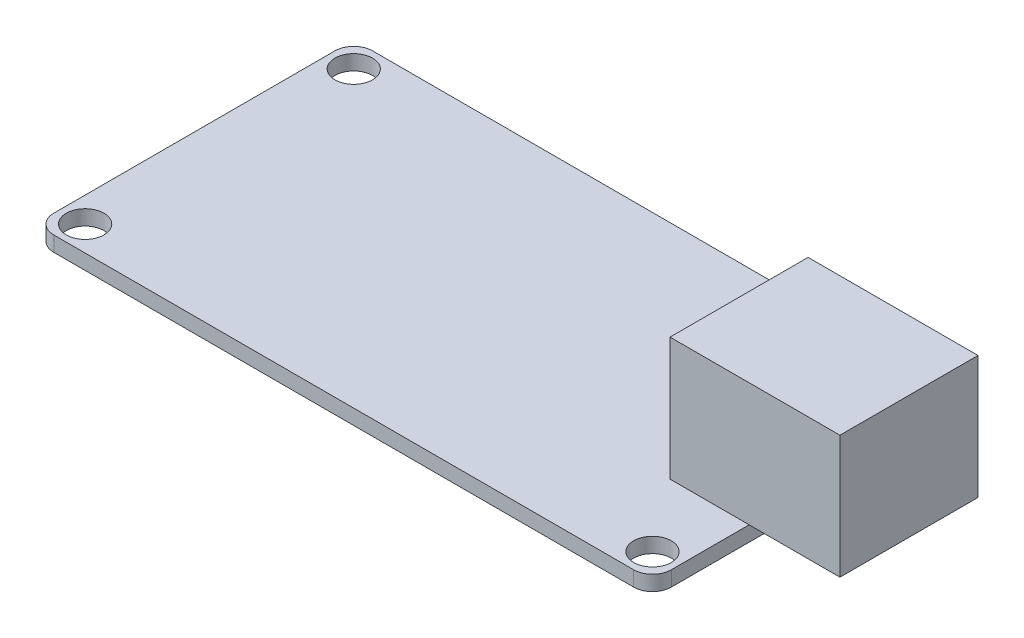
ISO-10303-21;
HEADER;
FILE_DESCRIPTION(('STEP AP214'),'2;1');
FILE_NAME('part.step','',(''),(''),'','','');
FILE_SCHEMA(('AUTOMOTIVE_DESIGN { 1 0 10303 214 1 1 1 1 }'));
ENDSEC;
DATA;
#1=APPLICATION_CONTEXT('core data for automotive mechanical design processes');
#2=APPLICATION_PROTOCOL_DEFINITION('international standard','automotive_design',2000,#1);
#3=PRODUCT_CONTEXT('',#1,'mechanical');
#4=PRODUCT('Part','Part','',(#3));
#5=PRODUCT_RELATED_PRODUCT_CATEGORY('part','',(#4));
#6=PRODUCT_DEFINITION_FORMATION('','',#4);
#7=PRODUCT_DEFINITION_CONTEXT('part definition',#1,'design');
#8=PRODUCT_DEFINITION('design','',#6,#7);
#9=PRODUCT_DEFINITION_SHAPE('','',#8);
#10=(LENGTH_UNIT() NAMED_UNIT(*) SI_UNIT(.MILLI.,.METRE.));
#11=(NAMED_UNIT(*) PLANE_ANGLE_UNIT() SI_UNIT($,.RADIAN.));
#12=(NAMED_UNIT(*) SI_UNIT($,.STERADIAN.) SOLID_ANGLE_UNIT());
#13=UNCERTAINTY_MEASURE_WITH_UNIT(LENGTH_MEASURE(1.E-05),#10,'distance_accuracy_value','');
#14=(GEOMETRIC_REPRESENTATION_CONTEXT(3) GLOBAL_UNCERTAINTY_ASSIGNED_CONTEXT((#13)) GLOBAL_UNIT_ASSIGNED_CONTEXT((#10,
#11,#12)) REPRESENTATION_CONTEXT('',''));
#15=CARTESIAN_POINT('',(0.,0.,0.));
#16=DIRECTION('',(0.,0.,1.));
#17=DIRECTION('',(1.,0.,0.));
#18=AXIS2_PLACEMENT_3D('',#15,#16,#17);
#19=CARTESIAN_POINT('',(0.,1.2,0.));
#20=DIRECTION('',(0.,-1.,0.));
#21=DIRECTION('',(0.,0.,-1.));
#22=AXIS2_PLACEMENT_3D('',#19,#20,#21);
#23=PLANE('',#22);
#24=CARTESIAN_POINT('',(-22.6,1.2,-10.7));
#25=DIRECTION('',(0.,1.,0.));
#26=DIRECTION('',(0.,0.,1.));
#27=AXIS2_PLACEMENT_3D('',#24,#25,#26);
#28=CIRCLE('',#27,1.5);
#29=CARTESIAN_POINT('',(-22.6,1.2,-9.2));
#30=VERTEX_POINT('',#29);
#31=EDGE_CURVE('E156',#30,#30,#28,.T.);
#32=ORIENTED_EDGE('',*,*,#31,.F.);
#33=EDGE_LOOP('',(#32));
#34=FACE_BOUND('',#33,.T.);
#35=CARTESIAN_POINT('',(22.6,1.2,10.7));
#36=DIRECTION('',(0.,1.,0.));
#37=DIRECTION('',(0.,0.,1.));
#38=AXIS2_PLACEMENT_3D('',#35,#36,#37);
#39=CIRCLE('',#38,1.5);
#40=CARTESIAN_POINT('',(22.6,1.2,12.2));
#41=VERTEX_POINT('',#40);
#42=EDGE_CURVE('E171',#41,#41,#39,.T.);
#43=ORIENTED_EDGE('',*,*,#42,.F.);
#44=EDGE_LOOP('',(#43));
#45=FACE_BOUND('',#44,.T.);
#46=CARTESIAN_POINT('',(22.6,1.2,-10.7));
#47=DIRECTION('',(0.,1.,0.));
#48=DIRECTION('',(0.,0.,1.));
#49=AXIS2_PLACEMENT_3D('',#46,#47,#48);
#50=CIRCLE('',#49,1.5);
#51=CARTESIAN_POINT('',(22.6,1.2,-9.2));
#52=VERTEX_POINT('',#51);
#53=EDGE_CURVE('E177',#52,#52,#50,.T.);
#54=ORIENTED_EDGE('',*,*,#53,.F.);
#55=EDGE_LOOP('',(#54));
#56=FACE_BOUND('',#55,.T.);
#57=CARTESIAN_POINT('',(-22.6,1.2,10.7));
#58=DIRECTION('',(0.,1.,0.));
#59=DIRECTION('',(0.,0.,1.));
#60=AXIS2_PLACEMENT_3D('',#57,#58,#59);
#61=CIRCLE('',#60,1.5);
#62=CARTESIAN_POINT('',(-22.6,1.2,12.2));
#63=VERTEX_POINT('',#62);
#64=EDGE_CURVE('E165',#63,#63,#61,.T.);
#65=ORIENTED_EDGE('',*,*,#64,.F.);
#66=EDGE_LOOP('',(#65));
#67=FACE_BOUND('',#66,.T.);
#68=DIRECTION('',(1.,0.,0.));
#69=VECTOR('',#68,1.);
#70=CARTESIAN_POINT('',(31.8316080107851,1.2,4.9991821349493));
#71=LINE('',#70,#69);
#72=CARTESIAN_POINT('',(18.2972512567052,1.2,4.9991821349493));
#73=VERTEX_POINT('',#72);
#74=CARTESIAN_POINT('',(24.6,1.2,4.9991821349493));
#75=VERTEX_POINT('',#74);
#76=EDGE_CURVE('E50',#73,#75,#71,.T.);
#77=ORIENTED_EDGE('',*,*,#76,.F.);
#78=DIRECTION('',(0.,0.,1.));
#79=VECTOR('',#78,1.);
#80=CARTESIAN_POINT('',(18.2972512567052,1.2,-6.0008178650507));
#81=LINE('',#80,#79);
#82=CARTESIAN_POINT('',(18.2972512567052,1.2,-6.0008178650507));
#83=VERTEX_POINT('',#82);
#84=EDGE_CURVE('E284',#83,#73,#81,.T.);
#85=ORIENTED_EDGE('',*,*,#84,.F.);
#86=DIRECTION('',(-1.,0.,0.));
#87=VECTOR('',#86,1.);
#88=CARTESIAN_POINT('',(31.8316080107851,1.2,-6.00081786505071));
#89=LINE('',#88,#87);
#90=CARTESIAN_POINT('',(24.6,1.2,-6.00081786505071));
#91=VERTEX_POINT('',#90);
#92=EDGE_CURVE('E11',#91,#83,#89,.T.);
#93=ORIENTED_EDGE('',*,*,#92,.F.);
#94=DIRECTION('',(0.,0.,-1.));
#95=VECTOR('',#94,1.);
#96=CARTESIAN_POINT('',(24.6,1.2,12.7));
#97=LINE('',#96,#95);
#98=CARTESIAN_POINT('',(24.6,1.2,-11.2));
#99=VERTEX_POINT('',#98);
#100=EDGE_CURVE('E187',#91,#99,#97,.T.);
#101=ORIENTED_EDGE('',*,*,#100,.T.);
#102=CARTESIAN_POINT('',(23.1,1.2,-11.2));
#103=DIRECTION('',(0.,-1.,0.));
#104=DIRECTION('',(0.,0.,-1.));
#105=AXIS2_PLACEMENT_3D('',#102,#103,#104);
#106=CIRCLE('',#105,1.5);
#107=CARTESIAN_POINT('',(23.1,1.2,-12.7));
#108=VERTEX_POINT('',#107);
#109=EDGE_CURVE('E233',#99,#108,#106,.F.);
#110=ORIENTED_EDGE('',*,*,#109,.T.);
#111=DIRECTION('',(-1.,0.,0.));
#112=VECTOR('',#111,1.);
#113=CARTESIAN_POINT('',(-24.6,1.2,-12.7));
#114=LINE('',#113,#112);
#115=CARTESIAN_POINT('',(-23.1,1.2,-12.7));
#116=VERTEX_POINT('',#115);
#117=EDGE_CURVE('E185',#108,#116,#114,.T.);
#118=ORIENTED_EDGE('',*,*,#117,.T.);
#119=CARTESIAN_POINT('',(-23.1,1.2,-11.2));
#120=DIRECTION('',(0.,-1.,0.));
#121=DIRECTION('',(0.,0.,-1.));
#122=AXIS2_PLACEMENT_3D('',#119,#120,#121);
#123=CIRCLE('',#122,1.5);
#124=CARTESIAN_POINT('',(-24.6,1.2,-11.2));
#125=VERTEX_POINT('',#124);
#126=EDGE_CURVE('E37',#116,#125,#123,.F.);
#127=ORIENTED_EDGE('',*,*,#126,.T.);
#128=DIRECTION('',(0.,0.,1.));
#129=VECTOR('',#128,1.);
#130=CARTESIAN_POINT('',(-24.6,1.2,12.7));
#131=LINE('',#130,#129);
#132=CARTESIAN_POINT('',(-24.6,1.2,11.2));
#133=VERTEX_POINT('',#132);
#134=EDGE_CURVE('E190',#125,#133,#131,.T.);
#135=ORIENTED_EDGE('',*,*,#134,.T.);
#136=CARTESIAN_POINT('',(-23.1,1.2,11.2));
#137=DIRECTION('',(0.,-1.,0.));
#138=DIRECTION('',(0.,0.,-1.));
#139=AXIS2_PLACEMENT_3D('',#136,#137,#138);
#140=CIRCLE('',#139,1.5);
#141=CARTESIAN_POINT('',(-23.1,1.2,12.7));
#142=VERTEX_POINT('',#141);
#143=EDGE_CURVE('E223',#133,#142,#140,.F.);
#144=ORIENTED_EDGE('',*,*,#143,.T.);
#145=DIRECTION('',(1.,0.,0.));
#146=VECTOR('',#145,1.);
#147=CARTESIAN_POINT('',(-24.6,1.2,12.7));
#148=LINE('',#147,#146);
#149=CARTESIAN_POINT('',(23.1,1.2,12.7));
#150=VERTEX_POINT('',#149);
#151=EDGE_CURVE('E192',#142,#150,#148,.T.);
#152=ORIENTED_EDGE('',*,*,#151,.T.);
#153=CARTESIAN_POINT('',(23.1,1.2,11.2));
#154=DIRECTION('',(0.,-1.,0.));
#155=DIRECTION('',(0.,0.,-1.));
#156=AXIS2_PLACEMENT_3D('',#153,#154,#155);
#157=CIRCLE('',#156,1.5);
#158=CARTESIAN_POINT('',(24.6,1.2,11.2));
#159=VERTEX_POINT('',#158);
#160=EDGE_CURVE('E212',#150,#159,#157,.F.);
#161=ORIENTED_EDGE('',*,*,#160,.T.);
#162=EDGE_CURVE('E183',#159,#75,#97,.T.);
#163=ORIENTED_EDGE('',*,*,#162,.T.);
#164=EDGE_LOOP('',(#77,#85,#93,#101,#110,#118,#127,#135,#144,#152,#161,#163));
#165=FACE_BOUND('',#164,.T.);
#166=ADVANCED_FACE('F33',(#34,#45,#56,#67,#165),#23,.F.);
#167=CARTESIAN_POINT('',(0.,0.,0.));
#168=DIRECTION('',(0.,-1.,0.));
#169=DIRECTION('',(0.,0.,-1.));
#170=AXIS2_PLACEMENT_3D('',#167,#168,#169);
#171=PLANE('',#170);
#172=CARTESIAN_POINT('',(-22.6,0.,10.7));
#173=DIRECTION('',(0.,1.,0.));
#174=DIRECTION('',(0.,0.,1.));
#175=AXIS2_PLACEMENT_3D('',#172,#173,#174);
#176=CIRCLE('',#175,1.5);
#177=CARTESIAN_POINT('',(-22.6,0.,12.2));
#178=VERTEX_POINT('',#177);
#179=EDGE_CURVE('E163',#178,#178,#176,.T.);
#180=ORIENTED_EDGE('',*,*,#179,.T.);
#181=EDGE_LOOP('',(#180));
#182=FACE_BOUND('',#181,.T.);
#183=CARTESIAN_POINT('',(22.6,0.,-10.7));
#184=DIRECTION('',(0.,1.,0.));
#185=DIRECTION('',(0.,0.,1.));
#186=AXIS2_PLACEMENT_3D('',#183,#184,#185);
#187=CIRCLE('',#186,1.5);
#188=CARTESIAN_POINT('',(22.6,0.,-9.2));
#189=VERTEX_POINT('',#188);
#190=EDGE_CURVE('E174',#189,#189,#187,.T.);
#191=ORIENTED_EDGE('',*,*,#190,.T.);
#192=EDGE_LOOP('',(#191));
#193=FACE_BOUND('',#192,.T.);
#194=DIRECTION('',(0.,0.,1.));
#195=VECTOR('',#194,1.);
#196=CARTESIAN_POINT('',(-24.6,0.,12.7));
#197=LINE('',#196,#195);
#198=CARTESIAN_POINT('',(-24.6,0.,-11.2));
#199=VERTEX_POINT('',#198);
#200=CARTESIAN_POINT('',(-24.6,0.,11.2));
#201=VERTEX_POINT('',#200);
#202=EDGE_CURVE('E200',#199,#201,#197,.T.);
#203=ORIENTED_EDGE('',*,*,#202,.F.);
#204=CARTESIAN_POINT('',(-23.1,0.,-11.2));
#205=DIRECTION('',(0.,-1.,0.));
#206=DIRECTION('',(0.,0.,-1.));
#207=AXIS2_PLACEMENT_3D('',#204,#205,#206);
#208=CIRCLE('',#207,1.5);
#209=CARTESIAN_POINT('',(-23.1,0.,-12.7));
#210=VERTEX_POINT('',#209);
#211=EDGE_CURVE('E238',#199,#210,#208,.T.);
#212=ORIENTED_EDGE('',*,*,#211,.T.);
#213=DIRECTION('',(-1.,0.,0.));
#214=VECTOR('',#213,1.);
#215=CARTESIAN_POINT('',(-24.6,0.,-12.7));
#216=LINE('',#215,#214);
#217=CARTESIAN_POINT('',(23.1,0.,-12.7));
#218=VERTEX_POINT('',#217);
#219=EDGE_CURVE('E197',#218,#210,#216,.T.);
#220=ORIENTED_EDGE('',*,*,#219,.F.);
#221=CARTESIAN_POINT('',(23.1,0.,-11.2));
#222=DIRECTION('',(0.,-1.,0.));
#223=DIRECTION('',(0.,0.,-1.));
#224=AXIS2_PLACEMENT_3D('',#221,#222,#223);
#225=CIRCLE('',#224,1.5);
#226=CARTESIAN_POINT('',(24.6,0.,-11.2));
#227=VERTEX_POINT('',#226);
#228=EDGE_CURVE('E228',#218,#227,#225,.T.);
#229=ORIENTED_EDGE('',*,*,#228,.T.);
#230=DIRECTION('',(0.,0.,-1.));
#231=VECTOR('',#230,1.);
#232=CARTESIAN_POINT('',(24.6,0.,12.7));
#233=LINE('',#232,#231);
#234=CARTESIAN_POINT('',(24.6,0.,11.2));
#235=VERTEX_POINT('',#234);
#236=EDGE_CURVE('E180',#235,#227,#233,.T.);
#237=ORIENTED_EDGE('',*,*,#236,.F.);
#238=CARTESIAN_POINT('',(23.1,0.,11.2));
#239=DIRECTION('',(0.,-1.,0.));
#240=DIRECTION('',(0.,0.,-1.));
#241=AXIS2_PLACEMENT_3D('',#238,#239,#240);
#242=CIRCLE('',#241,1.5);
#243=CARTESIAN_POINT('',(23.1,0.,12.7));
#244=VERTEX_POINT('',#243);
#245=EDGE_CURVE('E206',#235,#244,#242,.T.);
#246=ORIENTED_EDGE('',*,*,#245,.T.);
#247=DIRECTION('',(1.,0.,0.));
#248=VECTOR('',#247,1.);
#249=CARTESIAN_POINT('',(-24.6,0.,12.7));
#250=LINE('',#249,#248);
#251=CARTESIAN_POINT('',(-23.1,0.,12.7));
#252=VERTEX_POINT('',#251);
#253=EDGE_CURVE('E202',#252,#244,#250,.T.);
#254=ORIENTED_EDGE('',*,*,#253,.F.);
#255=CARTESIAN_POINT('',(-23.1,0.,11.2));
#256=DIRECTION('',(0.,-1.,0.));
#257=DIRECTION('',(0.,0.,-1.));
#258=AXIS2_PLACEMENT_3D('',#255,#256,#257);
#259=CIRCLE('',#258,1.5);
#260=EDGE_CURVE('E217',#252,#201,#259,.T.);
#261=ORIENTED_EDGE('',*,*,#260,.T.);
#262=EDGE_LOOP('',(#203,#212,#220,#229,#237,#246,#254,#261));
#263=FACE_BOUND('',#262,.T.);
#264=CARTESIAN_POINT('',(22.6,0.,10.7));
#265=DIRECTION('',(0.,1.,0.));
#266=DIRECTION('',(0.,0.,1.));
#267=AXIS2_PLACEMENT_3D('',#264,#265,#266);
#268=CIRCLE('',#267,1.5);
#269=CARTESIAN_POINT('',(22.6,0.,12.2));
#270=VERTEX_POINT('',#269);
#271=EDGE_CURVE('E168',#270,#270,#268,.T.);
#272=ORIENTED_EDGE('',*,*,#271,.T.);
#273=EDGE_LOOP('',(#272));
#274=FACE_BOUND('',#273,.T.);
#275=CARTESIAN_POINT('',(-22.6,0.,-10.7));
#276=DIRECTION('',(0.,1.,0.));
#277=DIRECTION('',(0.,0.,1.));
#278=AXIS2_PLACEMENT_3D('',#275,#276,#277);
#279=CIRCLE('',#278,1.5);
#280=CARTESIAN_POINT('',(-22.6,0.,-9.2));
#281=VERTEX_POINT('',#280);
#282=EDGE_CURVE('E153',#281,#281,#279,.T.);
#283=ORIENTED_EDGE('',*,*,#282,.T.);
#284=EDGE_LOOP('',(#283));
#285=FACE_BOUND('',#284,.T.);
#286=ADVANCED_FACE('F254',(#182,#193,#263,#274,#285),#171,.T.);
#287=CARTESIAN_POINT('',(24.6,1.2,12.7));
#288=DIRECTION('',(-1.,0.,0.));
#289=DIRECTION('',(0.,0.,1.));
#290=AXIS2_PLACEMENT_3D('',#287,#288,#289);
#291=PLANE('',#290);
#292=ORIENTED_EDGE('',*,*,#236,.T.);
#293=DIRECTION('',(0.,-1.,0.));
#294=VECTOR('',#293,1.);
#295=CARTESIAN_POINT('',(24.6,1.2,-11.2));
#296=LINE('',#295,#294);
#297=EDGE_CURVE('E230',#227,#99,#296,.F.);
#298=ORIENTED_EDGE('',*,*,#297,.T.);
#299=ORIENTED_EDGE('',*,*,#100,.F.);
#300=EDGE_CURVE('E186',#75,#91,#97,.T.);
#301=ORIENTED_EDGE('',*,*,#300,.F.);
#302=ORIENTED_EDGE('',*,*,#162,.F.);
#303=DIRECTION('',(0.,-1.,0.));
#304=VECTOR('',#303,1.);
#305=CARTESIAN_POINT('',(24.6,1.2,11.2));
#306=LINE('',#305,#304);
#307=EDGE_CURVE('E194',#159,#235,#306,.T.);
#308=ORIENTED_EDGE('',*,*,#307,.T.);
#309=EDGE_LOOP('',(#292,#298,#299,#301,#302,#308));
#310=FACE_BOUND('',#309,.T.);
#311=ADVANCED_FACE('F264',(#310),#291,.F.);
#312=CARTESIAN_POINT('',(-24.6,1.2,-12.7));
#313=DIRECTION('',(0.,0.,1.));
#314=DIRECTION('',(1.,0.,0.));
#315=AXIS2_PLACEMENT_3D('',#312,#313,#314);
#316=PLANE('',#315);
#317=ORIENTED_EDGE('',*,*,#219,.T.);
#318=DIRECTION('',(0.,-1.,0.));
#319=VECTOR('',#318,1.);
#320=CARTESIAN_POINT('',(-23.1,1.2,-12.7));
#321=LINE('',#320,#319);
#322=EDGE_CURVE('E239',#210,#116,#321,.F.);
#323=ORIENTED_EDGE('',*,*,#322,.T.);
#324=ORIENTED_EDGE('',*,*,#117,.F.);
#325=DIRECTION('',(0.,-1.,0.));
#326=VECTOR('',#325,1.);
#327=CARTESIAN_POINT('',(23.1,1.2,-12.7));
#328=LINE('',#327,#326);
#329=EDGE_CURVE('E225',#108,#218,#328,.T.);
#330=ORIENTED_EDGE('',*,*,#329,.T.);
#331=EDGE_LOOP('',(#317,#323,#324,#330));
#332=FACE_BOUND('',#331,.T.);
#333=ADVANCED_FACE('F256',(#332),#316,.F.);
#334=CARTESIAN_POINT('',(-24.6,1.2,12.7));
#335=DIRECTION('',(1.,0.,0.));
#336=DIRECTION('',(0.,0.,-1.));
#337=AXIS2_PLACEMENT_3D('',#334,#335,#336);
#338=PLANE('',#337);
#339=ORIENTED_EDGE('',*,*,#134,.F.);
#340=DIRECTION('',(0.,-1.,0.));
#341=VECTOR('',#340,1.);
#342=CARTESIAN_POINT('',(-24.6,1.2,-11.2));
#343=LINE('',#342,#341);
#344=EDGE_CURVE('E235',#125,#199,#343,.T.);
#345=ORIENTED_EDGE('',*,*,#344,.T.);
#346=ORIENTED_EDGE('',*,*,#202,.T.);
#347=DIRECTION('',(0.,-1.,0.));
#348=VECTOR('',#347,1.);
#349=CARTESIAN_POINT('',(-24.6,1.2,11.2));
#350=LINE('',#349,#348);
#351=EDGE_CURVE('E220',#201,#133,#350,.F.);
#352=ORIENTED_EDGE('',*,*,#351,.T.);
#353=EDGE_LOOP('',(#339,#345,#346,#352));
#354=FACE_BOUND('',#353,.T.);
#355=ADVANCED_FACE('F248',(#354),#338,.F.);
#356=CARTESIAN_POINT('',(-24.6,1.2,12.7));
#357=DIRECTION('',(0.,0.,-1.));
#358=DIRECTION('',(-1.,0.,0.));
#359=AXIS2_PLACEMENT_3D('',#356,#357,#358);
#360=PLANE('',#359);
#361=ORIENTED_EDGE('',*,*,#151,.F.);
#362=DIRECTION('',(0.,-1.,0.));
#363=VECTOR('',#362,1.);
#364=CARTESIAN_POINT('',(-23.1,1.2,12.7));
#365=LINE('',#364,#363);
#366=EDGE_CURVE('E214',#142,#252,#365,.T.);
#367=ORIENTED_EDGE('',*,*,#366,.T.);
#368=ORIENTED_EDGE('',*,*,#253,.T.);
#369=DIRECTION('',(0.,-1.,0.));
#370=VECTOR('',#369,1.);
#371=CARTESIAN_POINT('',(23.1,1.2,12.7));
#372=LINE('',#371,#370);
#373=EDGE_CURVE('E209',#244,#150,#372,.F.);
#374=ORIENTED_EDGE('',*,*,#373,.T.);
#375=EDGE_LOOP('',(#361,#367,#368,#374));
#376=FACE_BOUND('',#375,.T.);
#377=ADVANCED_FACE('F274',(#376),#360,.F.);
#378=CARTESIAN_POINT('',(22.6,1.2,-10.7));
#379=DIRECTION('',(0.,-1.,0.));
#380=DIRECTION('',(0.,0.,-1.));
#381=AXIS2_PLACEMENT_3D('',#378,#379,#380);
#382=CYLINDRICAL_SURFACE('',#381,1.5);
#383=ORIENTED_EDGE('',*,*,#53,.T.);
#384=EDGE_LOOP('',(#383));
#385=FACE_BOUND('',#384,.T.);
#386=ORIENTED_EDGE('',*,*,#190,.F.);
#387=EDGE_LOOP('',(#386));
#388=FACE_BOUND('',#387,.T.);
#389=ADVANCED_FACE('F318',(#385,#388),#382,.F.);
#390=CARTESIAN_POINT('',(22.6,1.2,10.7));
#391=DIRECTION('',(0.,-1.,0.));
#392=DIRECTION('',(0.,0.,-1.));
#393=AXIS2_PLACEMENT_3D('',#390,#391,#392);
#394=CYLINDRICAL_SURFACE('',#393,1.5);
#395=ORIENTED_EDGE('',*,*,#42,.T.);
#396=EDGE_LOOP('',(#395));
#397=FACE_BOUND('',#396,.T.);
#398=ORIENTED_EDGE('',*,*,#271,.F.);
#399=EDGE_LOOP('',(#398));
#400=FACE_BOUND('',#399,.T.);
#401=ADVANCED_FACE('F348',(#397,#400),#394,.F.);
#402=CARTESIAN_POINT('',(-22.6,1.2,10.7));
#403=DIRECTION('',(0.,-1.,0.));
#404=DIRECTION('',(0.,0.,-1.));
#405=AXIS2_PLACEMENT_3D('',#402,#403,#404);
#406=CYLINDRICAL_SURFACE('',#405,1.5);
#407=ORIENTED_EDGE('',*,*,#64,.T.);
#408=EDGE_LOOP('',(#407));
#409=FACE_BOUND('',#408,.T.);
#410=ORIENTED_EDGE('',*,*,#179,.F.);
#411=EDGE_LOOP('',(#410));
#412=FACE_BOUND('',#411,.T.);
#413=ADVANCED_FACE('F345',(#409,#412),#406,.F.);
#414=CARTESIAN_POINT('',(-22.6,1.2,-10.7));
#415=DIRECTION('',(0.,-1.,0.));
#416=DIRECTION('',(0.,0.,-1.));
#417=AXIS2_PLACEMENT_3D('',#414,#415,#416);
#418=CYLINDRICAL_SURFACE('',#417,1.5);
#419=ORIENTED_EDGE('',*,*,#31,.T.);
#420=EDGE_LOOP('',(#419));
#421=FACE_BOUND('',#420,.T.);
#422=ORIENTED_EDGE('',*,*,#282,.F.);
#423=EDGE_LOOP('',(#422));
#424=FACE_BOUND('',#423,.T.);
#425=ADVANCED_FACE('F330',(#421,#424),#418,.F.);
#426=CARTESIAN_POINT('',(23.1,1.2,11.2));
#427=DIRECTION('',(0.,-1.,0.));
#428=DIRECTION('',(0.,0.,-1.));
#429=AXIS2_PLACEMENT_3D('',#426,#427,#428);
#430=CYLINDRICAL_SURFACE('',#429,1.5);
#431=ORIENTED_EDGE('',*,*,#160,.F.);
#432=ORIENTED_EDGE('',*,*,#373,.F.);
#433=ORIENTED_EDGE('',*,*,#245,.F.);
#434=ORIENTED_EDGE('',*,*,#307,.F.);
#435=EDGE_LOOP('',(#431,#432,#433,#434));
#436=FACE_BOUND('',#435,.T.);
#437=ADVANCED_FACE('F269',(#436),#430,.T.);
#438=CARTESIAN_POINT('',(-23.1,1.2,11.2));
#439=DIRECTION('',(0.,-1.,0.));
#440=DIRECTION('',(0.,0.,-1.));
#441=AXIS2_PLACEMENT_3D('',#438,#439,#440);
#442=CYLINDRICAL_SURFACE('',#441,1.5);
#443=ORIENTED_EDGE('',*,*,#143,.F.);
#444=ORIENTED_EDGE('',*,*,#351,.F.);
#445=ORIENTED_EDGE('',*,*,#260,.F.);
#446=ORIENTED_EDGE('',*,*,#366,.F.);
#447=EDGE_LOOP('',(#443,#444,#445,#446));
#448=FACE_BOUND('',#447,.T.);
#449=ADVANCED_FACE('F277',(#448),#442,.T.);
#450=CARTESIAN_POINT('',(23.1,1.2,-11.2));
#451=DIRECTION('',(0.,-1.,0.));
#452=DIRECTION('',(0.,0.,-1.));
#453=AXIS2_PLACEMENT_3D('',#450,#451,#452);
#454=CYLINDRICAL_SURFACE('',#453,1.5);
#455=ORIENTED_EDGE('',*,*,#109,.F.);
#456=ORIENTED_EDGE('',*,*,#297,.F.);
#457=ORIENTED_EDGE('',*,*,#228,.F.);
#458=ORIENTED_EDGE('',*,*,#329,.F.);
#459=EDGE_LOOP('',(#455,#456,#457,#458));
#460=FACE_BOUND('',#459,.T.);
#461=ADVANCED_FACE('F260',(#460),#454,.T.);
#462=CARTESIAN_POINT('',(-23.1,1.2,-11.2));
#463=DIRECTION('',(0.,-1.,0.));
#464=DIRECTION('',(0.,0.,-1.));
#465=AXIS2_PLACEMENT_3D('',#462,#463,#464);
#466=CYLINDRICAL_SURFACE('',#465,1.5);
#467=ORIENTED_EDGE('',*,*,#126,.F.);
#468=ORIENTED_EDGE('',*,*,#322,.F.);
#469=ORIENTED_EDGE('',*,*,#211,.F.);
#470=ORIENTED_EDGE('',*,*,#344,.F.);
#471=EDGE_LOOP('',(#467,#468,#469,#470));
#472=FACE_BOUND('',#471,.T.);
#473=ADVANCED_FACE('F35',(#472),#466,.T.);
#474=CARTESIAN_POINT('',(31.8316080107851,11.,-6.00081786505071));
#475=DIRECTION('',(-1.,0.,0.));
#476=DIRECTION('',(0.,0.,1.));
#477=AXIS2_PLACEMENT_3D('',#474,#475,#476);
#478=PLANE('',#477);
#479=DIRECTION('',(0.,0.,-1.));
#480=VECTOR('',#479,1.);
#481=CARTESIAN_POINT('',(31.8316080107851,1.2,-6.00081786505071));
#482=LINE('',#481,#480);
#483=CARTESIAN_POINT('',(31.8316080107851,1.2,4.9991821349493));
#484=VERTEX_POINT('',#483);
#485=CARTESIAN_POINT('',(31.8316080107851,1.2,-6.00081786505071));
#486=VERTEX_POINT('',#485);
#487=EDGE_CURVE('E152',#484,#486,#482,.T.);
#488=ORIENTED_EDGE('',*,*,#487,.T.);
#489=DIRECTION('',(0.,-1.,0.));
#490=VECTOR('',#489,1.);
#491=CARTESIAN_POINT('',(31.8316080107851,11.,-6.00081786505071));
#492=LINE('',#491,#490);
#493=CARTESIAN_POINT('',(31.8316080107851,11.,-6.00081786505071));
#494=VERTEX_POINT('',#493);
#495=EDGE_CURVE('E133',#494,#486,#492,.T.);
#496=ORIENTED_EDGE('',*,*,#495,.F.);
#497=DIRECTION('',(0.,0.,-1.));
#498=VECTOR('',#497,1.);
#499=CARTESIAN_POINT('',(31.8316080107851,11.,-6.00081786505071));
#500=LINE('',#499,#498);
#501=CARTESIAN_POINT('',(31.8316080107851,11.,4.9991821349493));
#502=VERTEX_POINT('',#501);
#503=EDGE_CURVE('E140',#502,#494,#500,.T.);
#504=ORIENTED_EDGE('',*,*,#503,.F.);
#505=DIRECTION('',(0.,-1.,0.));
#506=VECTOR('',#505,1.);
#507=CARTESIAN_POINT('',(31.8316080107851,11.,4.9991821349493));
#508=LINE('',#507,#506);
#509=EDGE_CURVE('E291',#502,#484,#508,.T.);
#510=ORIENTED_EDGE('',*,*,#509,.T.);
#511=EDGE_LOOP('',(#488,#496,#504,#510));
#512=FACE_BOUND('',#511,.T.);
#513=ADVANCED_FACE('F150',(#512),#478,.F.);
#514=CARTESIAN_POINT('',(31.8316080107851,11.,-6.00081786505071));
#515=DIRECTION('',(0.,0.,1.));
#516=DIRECTION('',(1.,0.,0.));
#517=AXIS2_PLACEMENT_3D('',#514,#515,#516);
#518=PLANE('',#517);
#519=EDGE_CURVE('E43',#486,#91,#89,.T.);
#520=ORIENTED_EDGE('',*,*,#519,.T.);
#521=ORIENTED_EDGE('',*,*,#92,.T.);
#522=DIRECTION('',(0.,-1.,0.));
#523=VECTOR('',#522,1.);
#524=CARTESIAN_POINT('',(18.2972512567052,11.,-6.0008178650507));
#525=LINE('',#524,#523);
#526=CARTESIAN_POINT('',(18.2972512567052,11.,-6.0008178650507));
#527=VERTEX_POINT('',#526);
#528=EDGE_CURVE('E136',#527,#83,#525,.T.);
#529=ORIENTED_EDGE('',*,*,#528,.F.);
#530=DIRECTION('',(-1.,0.,0.));
#531=VECTOR('',#530,1.);
#532=CARTESIAN_POINT('',(31.8316080107851,11.,-6.00081786505071));
#533=LINE('',#532,#531);
#534=EDGE_CURVE('E128',#494,#527,#533,.T.);
#535=ORIENTED_EDGE('',*,*,#534,.F.);
#536=ORIENTED_EDGE('',*,*,#495,.T.);
#537=EDGE_LOOP('',(#520,#521,#529,#535,#536));
#538=FACE_BOUND('',#537,.T.);
#539=ADVANCED_FACE('F131',(#538),#518,.F.);
#540=CARTESIAN_POINT('',(18.2972512567052,11.,-6.0008178650507));
#541=DIRECTION('',(1.,0.,0.));
#542=DIRECTION('',(0.,0.,-1.));
#543=AXIS2_PLACEMENT_3D('',#540,#541,#542);
#544=PLANE('',#543);
#545=ORIENTED_EDGE('',*,*,#84,.T.);
#546=DIRECTION('',(0.,-1.,0.));
#547=VECTOR('',#546,1.);
#548=CARTESIAN_POINT('',(18.2972512567052,11.,4.9991821349493));
#549=LINE('',#548,#547);
#550=CARTESIAN_POINT('',(18.2972512567052,11.,4.9991821349493));
#551=VERTEX_POINT('',#550);
#552=EDGE_CURVE('E158',#551,#73,#549,.T.);
#553=ORIENTED_EDGE('',*,*,#552,.F.);
#554=DIRECTION('',(0.,0.,1.));
#555=VECTOR('',#554,1.);
#556=CARTESIAN_POINT('',(18.2972512567052,11.,-6.0008178650507));
#557=LINE('',#556,#555);
#558=EDGE_CURVE('E139',#527,#551,#557,.T.);
#559=ORIENTED_EDGE('',*,*,#558,.F.);
#560=ORIENTED_EDGE('',*,*,#528,.T.);
#561=EDGE_LOOP('',(#545,#553,#559,#560));
#562=FACE_BOUND('',#561,.T.);
#563=ADVANCED_FACE('F296',(#562),#544,.F.);
#564=CARTESIAN_POINT('',(31.8316080107851,11.,4.9991821349493));
#565=DIRECTION('',(0.,0.,-1.));
#566=DIRECTION('',(-1.,0.,0.));
#567=AXIS2_PLACEMENT_3D('',#564,#565,#566);
#568=PLANE('',#567);
#569=ORIENTED_EDGE('',*,*,#76,.T.);
#570=EDGE_CURVE('E281',#75,#484,#71,.T.);
#571=ORIENTED_EDGE('',*,*,#570,.T.);
#572=ORIENTED_EDGE('',*,*,#509,.F.);
#573=DIRECTION('',(1.,0.,0.));
#574=VECTOR('',#573,1.);
#575=CARTESIAN_POINT('',(31.8316080107851,11.,4.9991821349493));
#576=LINE('',#575,#574);
#577=EDGE_CURVE('E145',#551,#502,#576,.T.);
#578=ORIENTED_EDGE('',*,*,#577,.F.);
#579=ORIENTED_EDGE('',*,*,#552,.T.);
#580=EDGE_LOOP('',(#569,#571,#572,#578,#579));
#581=FACE_BOUND('',#580,.T.);
#582=ADVANCED_FACE('F287',(#581),#568,.F.);
#583=CARTESIAN_POINT('',(0.,11.,0.));
#584=DIRECTION('',(0.,-1.,0.));
#585=DIRECTION('',(0.,0.,-1.));
#586=AXIS2_PLACEMENT_3D('',#583,#584,#585);
#587=PLANE('',#586);
#588=ORIENTED_EDGE('',*,*,#503,.T.);
#589=ORIENTED_EDGE('',*,*,#534,.T.);
#590=ORIENTED_EDGE('',*,*,#558,.T.);
#591=ORIENTED_EDGE('',*,*,#577,.T.);
#592=EDGE_LOOP('',(#588,#589,#590,#591));
#593=FACE_BOUND('',#592,.T.);
#594=ADVANCED_FACE('F143',(#593),#587,.F.);
#595=CARTESIAN_POINT('',(0.,1.2,0.));
#596=DIRECTION('',(0.,-1.,0.));
#597=DIRECTION('',(0.,0.,-1.));
#598=AXIS2_PLACEMENT_3D('',#595,#596,#597);
#599=PLANE('',#598);
#600=ORIENTED_EDGE('',*,*,#570,.F.);
#601=ORIENTED_EDGE('',*,*,#300,.T.);
#602=ORIENTED_EDGE('',*,*,#519,.F.);
#603=ORIENTED_EDGE('',*,*,#487,.F.);
#604=EDGE_LOOP('',(#600,#601,#602,#603));
#605=FACE_BOUND('',#604,.T.);
#606=ADVANCED_FACE('F282',(#605),#599,.T.);
#607=CLOSED_SHELL('',(#166,#286,#311,#333,#355,#377,#389,#401,#413,#425,#437,#449,#461,#473,
#513,#539,#563,#582,#594,#606));
#608=MANIFOLD_SOLID_BREP('B2',#607);
#609=ADVANCED_BREP_SHAPE_REPRESENTATION('',(#18,#608),#14);
#610=SHAPE_DEFINITION_REPRESENTATION(#9,#609);
ENDSEC;
END-ISO-10303-21;
